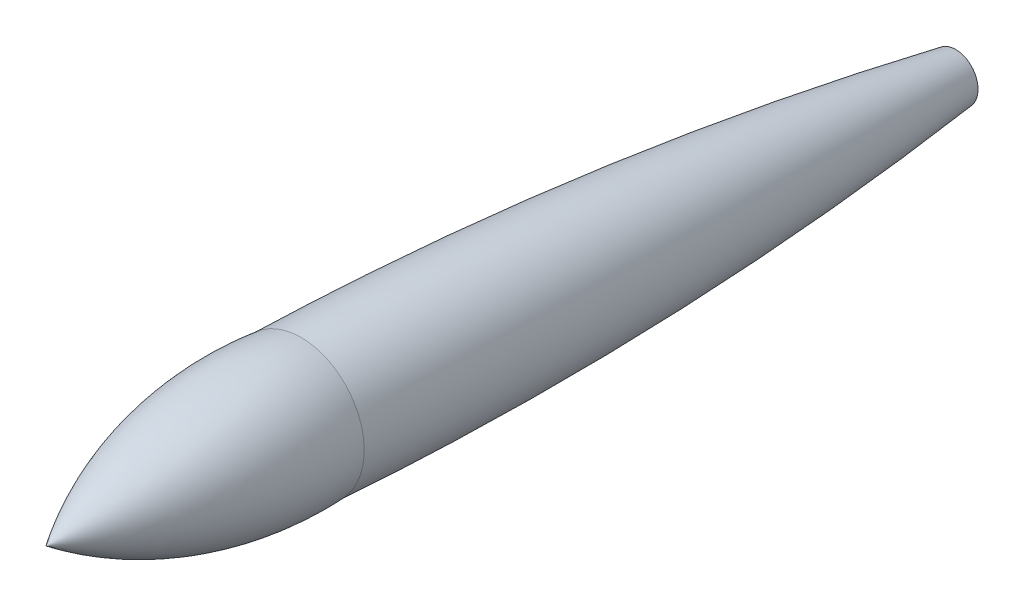
ISO-10303-21;
HEADER;
FILE_DESCRIPTION(('STEP AP214'),'2;1');
FILE_NAME('part.step','',(''),(''),'','','');
FILE_SCHEMA(('AUTOMOTIVE_DESIGN { 1 0 10303 214 1 1 1 1 }'));
ENDSEC;
DATA;
#1=APPLICATION_CONTEXT('core data for automotive mechanical design processes');
#2=APPLICATION_PROTOCOL_DEFINITION('international standard','automotive_design',2000,#1);
#3=PRODUCT_CONTEXT('',#1,'mechanical');
#4=PRODUCT('Part','Part','',(#3));
#5=PRODUCT_RELATED_PRODUCT_CATEGORY('part','',(#4));
#6=PRODUCT_DEFINITION_FORMATION('','',#4);
#7=PRODUCT_DEFINITION_CONTEXT('part definition',#1,'design');
#8=PRODUCT_DEFINITION('design','',#6,#7);
#9=PRODUCT_DEFINITION_SHAPE('','',#8);
#10=(LENGTH_UNIT() NAMED_UNIT(*) SI_UNIT(.MILLI.,.METRE.));
#11=(NAMED_UNIT(*) PLANE_ANGLE_UNIT() SI_UNIT($,.RADIAN.));
#12=(NAMED_UNIT(*) SI_UNIT($,.STERADIAN.) SOLID_ANGLE_UNIT());
#13=UNCERTAINTY_MEASURE_WITH_UNIT(LENGTH_MEASURE(1.E-05),#10,'distance_accuracy_value','');
#14=(GEOMETRIC_REPRESENTATION_CONTEXT(3) GLOBAL_UNCERTAINTY_ASSIGNED_CONTEXT((#13)) GLOBAL_UNIT_ASSIGNED_CONTEXT((#10,
#11,#12)) REPRESENTATION_CONTEXT('',''));
#15=CARTESIAN_POINT('',(0.,0.,0.));
#16=DIRECTION('',(0.,0.,1.));
#17=DIRECTION('',(1.,0.,0.));
#18=AXIS2_PLACEMENT_3D('',#15,#16,#17);
#19=CARTESIAN_POINT('',(0.,-32.5332924904628,79.1405343962925));
#20=DIRECTION('',(-1.,0.,0.));
#21=DIRECTION('',(0.,0.99858387505793,-0.0532000420515621));
#22=AXIS2_PLACEMENT_3D('',#19,#20,#21);
#23=CIRCLE('',#22,44.3593373489093);
#24=TRIMMED_CURVE('',#23,(PARAMETER_VALUE(-0.596551388184371)),
(PARAMETER_VALUE(0.596551388184371)),.T.,.PARAMETER.);
#25=CARTESIAN_POINT('',(0.,4.11224030438613,77.1882257977036));
#26=DIRECTION('',(0.,-0.0532000420515621,-0.99858387505793));
#27=AXIS1_PLACEMENT('',#25,#26);
#28=SURFACE_OF_REVOLUTION('',#24,#27);
#29=CARTESIAN_POINT('',(0.,3.9214206834556,73.6064730554556));
#30=DIRECTION('',(0.,-0.0532000420515621,-0.99858387505793));
#31=DIRECTION('',(0.,0.99858387505793,-0.0532000420515621));
#32=AXIS2_PLACEMENT_3D('',#29,#30,#31);
#33=CIRCLE('',#32,7.51658546054313);
#34=CARTESIAN_POINT('',(0.,11.4273617198489,73.2065903928705));
#35=VERTEX_POINT('',#34);
#36=EDGE_CURVE('E11',#35,#35,#33,.T.);
#37=ORIENTED_EDGE('',*,*,#36,.F.);
#38=EDGE_LOOP('',(#37));
#39=FACE_BOUND('',#38,.T.);
#40=CARTESIAN_POINT('',(0.,5.43802572923854,102.073693853561));
#41=VERTEX_POINT('',#40);
#42=VERTEX_LOOP('',#41);
#43=FACE_BOUND('',#42,.T.);
#44=ADVANCED_FACE('F33',(#39,#43),#28,.T.);
#45=CARTESIAN_POINT('',(0.,3.55467804394716,66.7225821413395));
#46=DIRECTION('',(0.,-0.0532000420515621,-0.99858387505793));
#47=DIRECTION('',(0.,0.99858387505793,-0.0532000420515621));
#48=AXIS2_PLACEMENT_3D('',#45,#46,#47);
#49=DEGENERATE_TOROIDAL_SURFACE('',#48,459.099286531008,466.666791671228,.F.);
#50=CARTESIAN_POINT('',(0.,-0.037091148305523,-0.69621416030798));
#51=DIRECTION('',(0.,-0.0532000420515621,-0.99858387505793));
#52=DIRECTION('',(0.,0.99858387505793,-0.0532000420515621));
#53=AXIS2_PLACEMENT_3D('',#50,#51,#52);
#54=CIRCLE('',#53,2.65790025445316);
#55=CARTESIAN_POINT('',(0.,2.61704518730377,-0.837614565613746));
#56=VERTEX_POINT('',#55);
#57=EDGE_CURVE('E40',#56,#56,#54,.T.);
#58=ORIENTED_EDGE('',*,*,#57,.F.);
#59=EDGE_LOOP('',(#58));
#60=FACE_BOUND('',#59,.T.);
#61=ORIENTED_EDGE('',*,*,#36,.T.);
#62=EDGE_LOOP('',(#61));
#63=FACE_BOUND('',#62,.T.);
#64=ADVANCED_FACE('F47',(#60,#63),#49,.F.);
#65=CARTESIAN_POINT('',(0.,-0.037091148305523,-0.69621416030798));
#66=DIRECTION('',(0.,-0.0532000420515621,-0.99858387505793));
#67=DIRECTION('',(0.,0.99858387505793,-0.0532000420515621));
#68=AXIS2_PLACEMENT_3D('',#65,#66,#67);
#69=CONICAL_SURFACE('',#68,2.65790025445316,1.31426305684588);
#70=CARTESIAN_POINT('',(0.,0.,0.));
#71=VERTEX_POINT('',#70);
#72=VERTEX_LOOP('',#71);
#73=FACE_BOUND('',#72,.T.);
#74=ORIENTED_EDGE('',*,*,#57,.T.);
#75=EDGE_LOOP('',(#74));
#76=FACE_BOUND('',#75,.T.);
#77=ADVANCED_FACE('F52',(#73,#76),#69,.F.);
#78=CLOSED_SHELL('',(#44,#64,#77));
#79=MANIFOLD_SOLID_BREP('B2',#78);
#80=ADVANCED_BREP_SHAPE_REPRESENTATION('',(#18,#79),#14);
#81=SHAPE_DEFINITION_REPRESENTATION(#9,#80);
ENDSEC;
END-ISO-10303-21;
